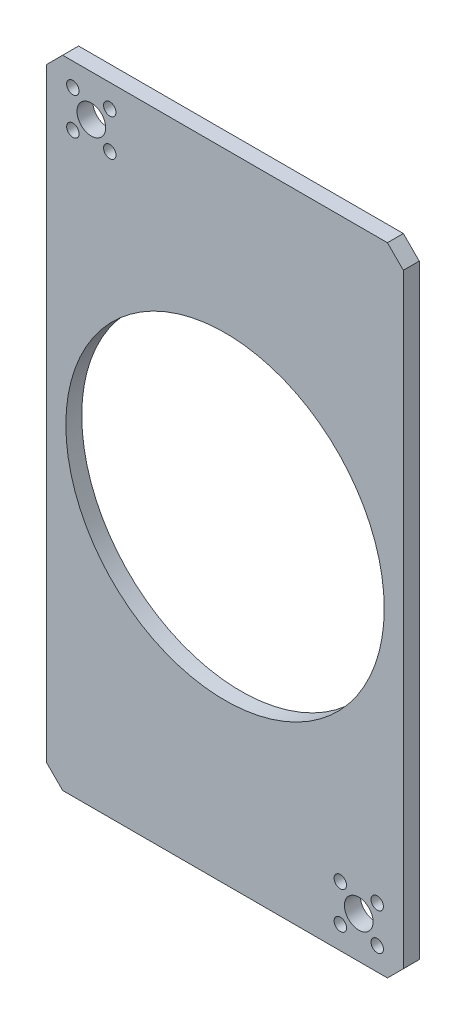
ISO-10303-21;
HEADER;
FILE_DESCRIPTION(('STEP AP214'),'2;1');
FILE_NAME('part.step','',(''),(''),'','','');
FILE_SCHEMA(('AUTOMOTIVE_DESIGN { 1 0 10303 214 1 1 1 1 }'));
ENDSEC;
DATA;
#1=APPLICATION_CONTEXT('core data for automotive mechanical design processes');
#2=APPLICATION_PROTOCOL_DEFINITION('international standard','automotive_design',2000,#1);
#3=PRODUCT_CONTEXT('',#1,'mechanical');
#4=PRODUCT('Part','Part','',(#3));
#5=PRODUCT_RELATED_PRODUCT_CATEGORY('part','',(#4));
#6=PRODUCT_DEFINITION_FORMATION('','',#4);
#7=PRODUCT_DEFINITION_CONTEXT('part definition',#1,'design');
#8=PRODUCT_DEFINITION('design','',#6,#7);
#9=PRODUCT_DEFINITION_SHAPE('','',#8);
#10=(LENGTH_UNIT() NAMED_UNIT(*) SI_UNIT(.MILLI.,.METRE.));
#11=(NAMED_UNIT(*) PLANE_ANGLE_UNIT() SI_UNIT($,.RADIAN.));
#12=(NAMED_UNIT(*) SI_UNIT($,.STERADIAN.) SOLID_ANGLE_UNIT());
#13=UNCERTAINTY_MEASURE_WITH_UNIT(LENGTH_MEASURE(1.E-05),#10,'distance_accuracy_value','');
#14=(GEOMETRIC_REPRESENTATION_CONTEXT(3) GLOBAL_UNCERTAINTY_ASSIGNED_CONTEXT((#13)) GLOBAL_UNIT_ASSIGNED_CONTEXT((#10,
#11,#12)) REPRESENTATION_CONTEXT('',''));
#15=CARTESIAN_POINT('',(0.,0.,0.));
#16=DIRECTION('',(0.,0.,1.));
#17=DIRECTION('',(1.,0.,0.));
#18=AXIS2_PLACEMENT_3D('',#15,#16,#17);
#19=CARTESIAN_POINT('',(56.,-100.,5.));
#20=DIRECTION('',(-1.,0.,0.));
#21=DIRECTION('',(0.,0.,1.));
#22=AXIS2_PLACEMENT_3D('',#19,#20,#21);
#23=PLANE('',#22);
#24=DIRECTION('',(0.,1.,0.));
#25=VECTOR('',#24,1.);
#26=CARTESIAN_POINT('',(56.,-100.,5.));
#27=LINE('',#26,#25);
#28=CARTESIAN_POINT('',(56.,-95.,5.));
#29=VERTEX_POINT('',#28);
#30=CARTESIAN_POINT('',(56.,95.,5.));
#31=VERTEX_POINT('',#30);
#32=EDGE_CURVE('E125',#29,#31,#27,.T.);
#33=ORIENTED_EDGE('',*,*,#32,.F.);
#34=DIRECTION('',(0.,0.,-1.));
#35=VECTOR('',#34,1.);
#36=CARTESIAN_POINT('',(56.,-95.,5.));
#37=LINE('',#36,#35);
#38=CARTESIAN_POINT('',(56.,-95.,0.));
#39=VERTEX_POINT('',#38);
#40=EDGE_CURVE('E151',#29,#39,#37,.T.);
#41=ORIENTED_EDGE('',*,*,#40,.T.);
#42=DIRECTION('',(0.,1.,0.));
#43=VECTOR('',#42,1.);
#44=CARTESIAN_POINT('',(56.,-100.,0.));
#45=LINE('',#44,#43);
#46=CARTESIAN_POINT('',(56.,95.,0.));
#47=VERTEX_POINT('',#46);
#48=EDGE_CURVE('E157',#39,#47,#45,.T.);
#49=ORIENTED_EDGE('',*,*,#48,.T.);
#50=DIRECTION('',(0.,0.,1.));
#51=VECTOR('',#50,1.);
#52=CARTESIAN_POINT('',(56.,95.,5.));
#53=LINE('',#52,#51);
#54=EDGE_CURVE('E149',#47,#31,#53,.T.);
#55=ORIENTED_EDGE('',*,*,#54,.T.);
#56=EDGE_LOOP('',(#33,#41,#49,#55));
#57=FACE_BOUND('',#56,.T.);
#58=ADVANCED_FACE('F33',(#57),#23,.F.);
#59=CARTESIAN_POINT('',(-56.,100.,5.));
#60=DIRECTION('',(0.,-1.,0.));
#61=DIRECTION('',(0.,0.,-1.));
#62=AXIS2_PLACEMENT_3D('',#59,#60,#61);
#63=PLANE('',#62);
#64=DIRECTION('',(-1.,0.,0.));
#65=VECTOR('',#64,1.);
#66=CARTESIAN_POINT('',(-56.,100.,5.));
#67=LINE('',#66,#65);
#68=CARTESIAN_POINT('',(51.,100.,5.));
#69=VERTEX_POINT('',#68);
#70=CARTESIAN_POINT('',(-51.,100.,5.));
#71=VERTEX_POINT('',#70);
#72=EDGE_CURVE('E128',#69,#71,#67,.T.);
#73=ORIENTED_EDGE('',*,*,#72,.F.);
#74=DIRECTION('',(0.,0.,-1.));
#75=VECTOR('',#74,1.);
#76=CARTESIAN_POINT('',(51.,100.,5.));
#77=LINE('',#76,#75);
#78=CARTESIAN_POINT('',(51.,100.,0.));
#79=VERTEX_POINT('',#78);
#80=EDGE_CURVE('E11',#69,#79,#77,.T.);
#81=ORIENTED_EDGE('',*,*,#80,.T.);
#82=DIRECTION('',(-1.,0.,0.));
#83=VECTOR('',#82,1.);
#84=CARTESIAN_POINT('',(-56.,100.,0.));
#85=LINE('',#84,#83);
#86=CARTESIAN_POINT('',(-51.,100.,0.));
#87=VERTEX_POINT('',#86);
#88=EDGE_CURVE('E130',#79,#87,#85,.T.);
#89=ORIENTED_EDGE('',*,*,#88,.T.);
#90=DIRECTION('',(0.,0.,1.));
#91=VECTOR('',#90,1.);
#92=CARTESIAN_POINT('',(-51.,100.,5.));
#93=LINE('',#92,#91);
#94=EDGE_CURVE('E41',#87,#71,#93,.T.);
#95=ORIENTED_EDGE('',*,*,#94,.T.);
#96=EDGE_LOOP('',(#73,#81,#89,#95));
#97=FACE_BOUND('',#96,.T.);
#98=ADVANCED_FACE('F273',(#97),#63,.F.);
#99=CARTESIAN_POINT('',(-56.,-100.,5.));
#100=DIRECTION('',(1.,0.,0.));
#101=DIRECTION('',(0.,0.,-1.));
#102=AXIS2_PLACEMENT_3D('',#99,#100,#101);
#103=PLANE('',#102);
#104=DIRECTION('',(0.,-1.,0.));
#105=VECTOR('',#104,1.);
#106=CARTESIAN_POINT('',(-56.,-100.,0.));
#107=LINE('',#106,#105);
#108=CARTESIAN_POINT('',(-56.,95.,0.));
#109=VERTEX_POINT('',#108);
#110=CARTESIAN_POINT('',(-56.,-95.,0.));
#111=VERTEX_POINT('',#110);
#112=EDGE_CURVE('E126',#109,#111,#107,.T.);
#113=ORIENTED_EDGE('',*,*,#112,.T.);
#114=DIRECTION('',(0.,0.,1.));
#115=VECTOR('',#114,1.);
#116=CARTESIAN_POINT('',(-56.,-95.,5.));
#117=LINE('',#116,#115);
#118=CARTESIAN_POINT('',(-56.,-95.,5.));
#119=VERTEX_POINT('',#118);
#120=EDGE_CURVE('E104',#111,#119,#117,.T.);
#121=ORIENTED_EDGE('',*,*,#120,.T.);
#122=DIRECTION('',(0.,-1.,0.));
#123=VECTOR('',#122,1.);
#124=CARTESIAN_POINT('',(-56.,-100.,5.));
#125=LINE('',#124,#123);
#126=CARTESIAN_POINT('',(-56.,95.,5.));
#127=VERTEX_POINT('',#126);
#128=EDGE_CURVE('E169',#127,#119,#125,.T.);
#129=ORIENTED_EDGE('',*,*,#128,.F.);
#130=DIRECTION('',(0.,0.,-1.));
#131=VECTOR('',#130,1.);
#132=CARTESIAN_POINT('',(-56.,95.,5.));
#133=LINE('',#132,#131);
#134=EDGE_CURVE('E109',#127,#109,#133,.T.);
#135=ORIENTED_EDGE('',*,*,#134,.T.);
#136=EDGE_LOOP('',(#113,#121,#129,#135));
#137=FACE_BOUND('',#136,.T.);
#138=ADVANCED_FACE('F271',(#137),#103,.F.);
#139=CARTESIAN_POINT('',(-56.,-100.,5.));
#140=DIRECTION('',(0.,1.,0.));
#141=DIRECTION('',(0.,0.,1.));
#142=AXIS2_PLACEMENT_3D('',#139,#140,#141);
#143=PLANE('',#142);
#144=DIRECTION('',(1.,0.,0.));
#145=VECTOR('',#144,1.);
#146=CARTESIAN_POINT('',(-56.,-100.,5.));
#147=LINE('',#146,#145);
#148=CARTESIAN_POINT('',(-51.,-100.,5.));
#149=VERTEX_POINT('',#148);
#150=CARTESIAN_POINT('',(51.,-100.,5.));
#151=VERTEX_POINT('',#150);
#152=EDGE_CURVE('E119',#149,#151,#147,.T.);
#153=ORIENTED_EDGE('',*,*,#152,.F.);
#154=DIRECTION('',(0.,0.,-1.));
#155=VECTOR('',#154,1.);
#156=CARTESIAN_POINT('',(-51.,-100.,5.));
#157=LINE('',#156,#155);
#158=CARTESIAN_POINT('',(-51.,-100.,0.));
#159=VERTEX_POINT('',#158);
#160=EDGE_CURVE('E103',#149,#159,#157,.T.);
#161=ORIENTED_EDGE('',*,*,#160,.T.);
#162=DIRECTION('',(1.,0.,0.));
#163=VECTOR('',#162,1.);
#164=CARTESIAN_POINT('',(-56.,-100.,0.));
#165=LINE('',#164,#163);
#166=CARTESIAN_POINT('',(51.,-100.,0.));
#167=VERTEX_POINT('',#166);
#168=EDGE_CURVE('E116',#159,#167,#165,.T.);
#169=ORIENTED_EDGE('',*,*,#168,.T.);
#170=DIRECTION('',(0.,0.,1.));
#171=VECTOR('',#170,1.);
#172=CARTESIAN_POINT('',(51.,-100.,5.));
#173=LINE('',#172,#171);
#174=EDGE_CURVE('E121',#167,#151,#173,.T.);
#175=ORIENTED_EDGE('',*,*,#174,.T.);
#176=EDGE_LOOP('',(#153,#161,#169,#175));
#177=FACE_BOUND('',#176,.T.);
#178=ADVANCED_FACE('F115',(#177),#143,.F.);
#179=CARTESIAN_POINT('',(0.,0.,5.));
#180=DIRECTION('',(0.,0.,-1.));
#181=DIRECTION('',(-1.,0.,0.));
#182=AXIS2_PLACEMENT_3D('',#179,#180,#181);
#183=PLANE('',#182);
#184=CARTESIAN_POINT('',(0.,0.,5.));
#185=DIRECTION('',(0.,0.,1.));
#186=DIRECTION('',(1.,0.,0.));
#187=AXIS2_PLACEMENT_3D('',#184,#185,#186);
#188=CIRCLE('',#187,50.);
#189=CARTESIAN_POINT('',(50.,0.,5.));
#190=VERTEX_POINT('',#189);
#191=EDGE_CURVE('E230',#190,#190,#188,.T.);
#192=ORIENTED_EDGE('',*,*,#191,.F.);
#193=EDGE_LOOP('',(#192));
#194=FACE_BOUND('',#193,.T.);
#195=CARTESIAN_POINT('',(47.8000000000095,-81.2,5.));
#196=DIRECTION('',(0.,0.,1.));
#197=DIRECTION('',(-1.,0.,0.));
#198=AXIS2_PLACEMENT_3D('',#195,#196,#197);
#199=CIRCLE('',#198,1.94999999999284);
#200=CARTESIAN_POINT('',(45.8500000000166,-81.2,5.));
#201=VERTEX_POINT('',#200);
#202=EDGE_CURVE('E206',#201,#201,#199,.T.);
#203=ORIENTED_EDGE('',*,*,#202,.F.);
#204=EDGE_LOOP('',(#203));
#205=FACE_BOUND('',#204,.T.);
#206=CARTESIAN_POINT('',(47.8000000000095,-92.8,5.));
#207=DIRECTION('',(0.,0.,1.));
#208=DIRECTION('',(1.,0.,0.));
#209=AXIS2_PLACEMENT_3D('',#206,#207,#208);
#210=CIRCLE('',#209,1.94999999999284);
#211=CARTESIAN_POINT('',(49.7500000000023,-92.8,5.));
#212=VERTEX_POINT('',#211);
#213=EDGE_CURVE('E213',#212,#212,#210,.T.);
#214=ORIENTED_EDGE('',*,*,#213,.F.);
#215=EDGE_LOOP('',(#214));
#216=FACE_BOUND('',#215,.T.);
#217=CARTESIAN_POINT('',(42.0000000000095,-87.,5.));
#218=DIRECTION('',(0.,0.,1.));
#219=DIRECTION('',(1.,0.,0.));
#220=AXIS2_PLACEMENT_3D('',#217,#218,#219);
#221=CIRCLE('',#220,4.49999999999287);
#222=CARTESIAN_POINT('',(46.5000000000024,-87.,5.));
#223=VERTEX_POINT('',#222);
#224=EDGE_CURVE('E200',#223,#223,#221,.T.);
#225=ORIENTED_EDGE('',*,*,#224,.F.);
#226=EDGE_LOOP('',(#225));
#227=FACE_BOUND('',#226,.T.);
#228=CARTESIAN_POINT('',(36.2000000000095,-81.2,5.));
#229=DIRECTION('',(0.,0.,1.));
#230=DIRECTION('',(1.,0.,0.));
#231=AXIS2_PLACEMENT_3D('',#228,#229,#230);
#232=CIRCLE('',#231,1.94999999999285);
#233=CARTESIAN_POINT('',(38.1500000000023,-81.2,5.));
#234=VERTEX_POINT('',#233);
#235=EDGE_CURVE('E225',#234,#234,#232,.T.);
#236=ORIENTED_EDGE('',*,*,#235,.F.);
#237=EDGE_LOOP('',(#236));
#238=FACE_BOUND('',#237,.T.);
#239=CARTESIAN_POINT('',(36.2000000000095,-92.8,5.));
#240=DIRECTION('',(0.,0.,1.));
#241=DIRECTION('',(-1.,0.,0.));
#242=AXIS2_PLACEMENT_3D('',#239,#240,#241);
#243=CIRCLE('',#242,1.94999999999285);
#244=CARTESIAN_POINT('',(34.2500000000166,-92.8,5.));
#245=VERTEX_POINT('',#244);
#246=EDGE_CURVE('E218',#245,#245,#243,.T.);
#247=ORIENTED_EDGE('',*,*,#246,.F.);
#248=EDGE_LOOP('',(#247));
#249=FACE_BOUND('',#248,.T.);
#250=CARTESIAN_POINT('',(-36.2000000000095,92.8,5.));
#251=DIRECTION('',(0.,0.,1.));
#252=DIRECTION('',(-1.,0.,0.));
#253=AXIS2_PLACEMENT_3D('',#250,#251,#252);
#254=CIRCLE('',#253,1.95000000000713);
#255=CARTESIAN_POINT('',(-38.1500000000166,92.8,5.));
#256=VERTEX_POINT('',#255);
#257=EDGE_CURVE('E176',#256,#256,#254,.T.);
#258=ORIENTED_EDGE('',*,*,#257,.F.);
#259=EDGE_LOOP('',(#258));
#260=FACE_BOUND('',#259,.T.);
#261=CARTESIAN_POINT('',(-36.2000000000095,81.2,5.));
#262=DIRECTION('',(0.,0.,1.));
#263=DIRECTION('',(1.,0.,0.));
#264=AXIS2_PLACEMENT_3D('',#261,#262,#263);
#265=CIRCLE('',#264,1.95000000000713);
#266=CARTESIAN_POINT('',(-34.2500000000023,81.2,5.));
#267=VERTEX_POINT('',#266);
#268=EDGE_CURVE('E183',#267,#267,#265,.T.);
#269=ORIENTED_EDGE('',*,*,#268,.F.);
#270=EDGE_LOOP('',(#269));
#271=FACE_BOUND('',#270,.T.);
#272=CARTESIAN_POINT('',(-47.8000000000095,81.2,5.));
#273=DIRECTION('',(0.,0.,1.));
#274=DIRECTION('',(-1.,0.,0.));
#275=AXIS2_PLACEMENT_3D('',#272,#273,#274);
#276=CIRCLE('',#275,1.95000000000712);
#277=CARTESIAN_POINT('',(-49.7500000000166,81.2,5.));
#278=VERTEX_POINT('',#277);
#279=EDGE_CURVE('E189',#278,#278,#276,.T.);
#280=ORIENTED_EDGE('',*,*,#279,.F.);
#281=EDGE_LOOP('',(#280));
#282=FACE_BOUND('',#281,.T.);
#283=CARTESIAN_POINT('',(-47.8000000000095,92.8,5.));
#284=DIRECTION('',(0.,0.,1.));
#285=DIRECTION('',(1.,0.,0.));
#286=AXIS2_PLACEMENT_3D('',#283,#284,#285);
#287=CIRCLE('',#286,1.95000000000713);
#288=CARTESIAN_POINT('',(-45.8500000000023,92.8,5.));
#289=VERTEX_POINT('',#288);
#290=EDGE_CURVE('E195',#289,#289,#287,.T.);
#291=ORIENTED_EDGE('',*,*,#290,.F.);
#292=EDGE_LOOP('',(#291));
#293=FACE_BOUND('',#292,.T.);
#294=CARTESIAN_POINT('',(-42.0000000000095,87.,5.));
#295=DIRECTION('',(0.,0.,1.));
#296=DIRECTION('',(1.,0.,0.));
#297=AXIS2_PLACEMENT_3D('',#294,#295,#296);
#298=CIRCLE('',#297,4.50000000000714);
#299=CARTESIAN_POINT('',(-37.5000000000024,87.,5.));
#300=VERTEX_POINT('',#299);
#301=EDGE_CURVE('E165',#300,#300,#298,.T.);
#302=ORIENTED_EDGE('',*,*,#301,.F.);
#303=EDGE_LOOP('',(#302));
#304=FACE_BOUND('',#303,.T.);
#305=ORIENTED_EDGE('',*,*,#128,.T.);
#306=DIRECTION('',(-0.707106781186548,0.707106781186548,0.));
#307=VECTOR('',#306,1.);
#308=CARTESIAN_POINT('',(-51.,-100.,5.));
#309=LINE('',#308,#307);
#310=EDGE_CURVE('E147',#119,#149,#309,.F.);
#311=ORIENTED_EDGE('',*,*,#310,.T.);
#312=ORIENTED_EDGE('',*,*,#152,.T.);
#313=DIRECTION('',(-0.707106781186548,-0.707106781186548,0.));
#314=VECTOR('',#313,1.);
#315=CARTESIAN_POINT('',(56.,-95.,5.));
#316=LINE('',#315,#314);
#317=EDGE_CURVE('E145',#151,#29,#316,.F.);
#318=ORIENTED_EDGE('',*,*,#317,.T.);
#319=ORIENTED_EDGE('',*,*,#32,.T.);
#320=DIRECTION('',(0.707106781186548,-0.707106781186548,0.));
#321=VECTOR('',#320,1.);
#322=CARTESIAN_POINT('',(51.,100.,5.));
#323=LINE('',#322,#321);
#324=EDGE_CURVE('E54',#31,#69,#323,.F.);
#325=ORIENTED_EDGE('',*,*,#324,.T.);
#326=ORIENTED_EDGE('',*,*,#72,.T.);
#327=DIRECTION('',(0.707106781186548,0.707106781186548,0.));
#328=VECTOR('',#327,1.);
#329=CARTESIAN_POINT('',(-56.,95.,5.));
#330=LINE('',#329,#328);
#331=EDGE_CURVE('E142',#71,#127,#330,.F.);
#332=ORIENTED_EDGE('',*,*,#331,.T.);
#333=EDGE_LOOP('',(#305,#311,#312,#318,#319,#325,#326,#332));
#334=FACE_BOUND('',#333,.T.);
#335=ADVANCED_FACE('F244',(#194,#205,#216,#227,#238,#249,#260,#271,#282,#293,#304,#334),#183,.F.);
#336=CARTESIAN_POINT('',(0.,0.,0.));
#337=DIRECTION('',(0.,0.,-1.));
#338=DIRECTION('',(-1.,0.,0.));
#339=AXIS2_PLACEMENT_3D('',#336,#337,#338);
#340=PLANE('',#339);
#341=CARTESIAN_POINT('',(0.,0.,0.));
#342=DIRECTION('',(0.,0.,1.));
#343=DIRECTION('',(1.,0.,0.));
#344=AXIS2_PLACEMENT_3D('',#341,#342,#343);
#345=CIRCLE('',#344,50.);
#346=CARTESIAN_POINT('',(50.,0.,0.));
#347=VERTEX_POINT('',#346);
#348=EDGE_CURVE('E222',#347,#347,#345,.T.);
#349=ORIENTED_EDGE('',*,*,#348,.T.);
#350=EDGE_LOOP('',(#349));
#351=FACE_BOUND('',#350,.T.);
#352=CARTESIAN_POINT('',(47.8000000000095,-81.2,0.));
#353=DIRECTION('',(0.,0.,1.));
#354=DIRECTION('',(-1.,0.,0.));
#355=AXIS2_PLACEMENT_3D('',#352,#353,#354);
#356=CIRCLE('',#355,1.94999999999284);
#357=CARTESIAN_POINT('',(45.8500000000166,-81.2,0.));
#358=VERTEX_POINT('',#357);
#359=EDGE_CURVE('E209',#358,#358,#356,.T.);
#360=ORIENTED_EDGE('',*,*,#359,.T.);
#361=EDGE_LOOP('',(#360));
#362=FACE_BOUND('',#361,.T.);
#363=CARTESIAN_POINT('',(47.8000000000095,-92.8,0.));
#364=DIRECTION('',(0.,0.,1.));
#365=DIRECTION('',(1.,0.,0.));
#366=AXIS2_PLACEMENT_3D('',#363,#364,#365);
#367=CIRCLE('',#366,1.94999999999284);
#368=CARTESIAN_POINT('',(49.7500000000023,-92.8,0.));
#369=VERTEX_POINT('',#368);
#370=EDGE_CURVE('E203',#369,#369,#367,.T.);
#371=ORIENTED_EDGE('',*,*,#370,.T.);
#372=EDGE_LOOP('',(#371));
#373=FACE_BOUND('',#372,.T.);
#374=CARTESIAN_POINT('',(42.0000000000095,-87.,0.));
#375=DIRECTION('',(0.,0.,1.));
#376=DIRECTION('',(1.,0.,0.));
#377=AXIS2_PLACEMENT_3D('',#374,#375,#376);
#378=CIRCLE('',#377,4.49999999999287);
#379=CARTESIAN_POINT('',(46.5000000000024,-87.,0.));
#380=VERTEX_POINT('',#379);
#381=EDGE_CURVE('E180',#380,#380,#378,.T.);
#382=ORIENTED_EDGE('',*,*,#381,.T.);
#383=EDGE_LOOP('',(#382));
#384=FACE_BOUND('',#383,.T.);
#385=CARTESIAN_POINT('',(36.2000000000095,-81.2,0.));
#386=DIRECTION('',(0.,0.,1.));
#387=DIRECTION('',(1.,0.,0.));
#388=AXIS2_PLACEMENT_3D('',#385,#386,#387);
#389=CIRCLE('',#388,1.94999999999285);
#390=CARTESIAN_POINT('',(38.1500000000023,-81.2,0.));
#391=VERTEX_POINT('',#390);
#392=EDGE_CURVE('E210',#391,#391,#389,.T.);
#393=ORIENTED_EDGE('',*,*,#392,.T.);
#394=EDGE_LOOP('',(#393));
#395=FACE_BOUND('',#394,.T.);
#396=CARTESIAN_POINT('',(36.2000000000095,-92.8,0.));
#397=DIRECTION('',(0.,0.,1.));
#398=DIRECTION('',(-1.,0.,0.));
#399=AXIS2_PLACEMENT_3D('',#396,#397,#398);
#400=CIRCLE('',#399,1.94999999999285);
#401=CARTESIAN_POINT('',(34.2500000000166,-92.8,0.));
#402=VERTEX_POINT('',#401);
#403=EDGE_CURVE('E221',#402,#402,#400,.T.);
#404=ORIENTED_EDGE('',*,*,#403,.T.);
#405=EDGE_LOOP('',(#404));
#406=FACE_BOUND('',#405,.T.);
#407=CARTESIAN_POINT('',(-36.2000000000095,92.8,0.));
#408=DIRECTION('',(0.,0.,1.));
#409=DIRECTION('',(-1.,0.,0.));
#410=AXIS2_PLACEMENT_3D('',#407,#408,#409);
#411=CIRCLE('',#410,1.95000000000713);
#412=CARTESIAN_POINT('',(-38.1500000000166,92.8,0.));
#413=VERTEX_POINT('',#412);
#414=EDGE_CURVE('E179',#413,#413,#411,.T.);
#415=ORIENTED_EDGE('',*,*,#414,.T.);
#416=EDGE_LOOP('',(#415));
#417=FACE_BOUND('',#416,.T.);
#418=CARTESIAN_POINT('',(-36.2000000000095,81.2,0.));
#419=DIRECTION('',(0.,0.,1.));
#420=DIRECTION('',(1.,0.,0.));
#421=AXIS2_PLACEMENT_3D('',#418,#419,#420);
#422=CIRCLE('',#421,1.95000000000713);
#423=CARTESIAN_POINT('',(-34.2500000000023,81.2,0.));
#424=VERTEX_POINT('',#423);
#425=EDGE_CURVE('E186',#424,#424,#422,.T.);
#426=ORIENTED_EDGE('',*,*,#425,.T.);
#427=EDGE_LOOP('',(#426));
#428=FACE_BOUND('',#427,.T.);
#429=CARTESIAN_POINT('',(-47.8000000000095,81.2,0.));
#430=DIRECTION('',(0.,0.,1.));
#431=DIRECTION('',(-1.,0.,0.));
#432=AXIS2_PLACEMENT_3D('',#429,#430,#431);
#433=CIRCLE('',#432,1.95000000000712);
#434=CARTESIAN_POINT('',(-49.7500000000166,81.2,0.));
#435=VERTEX_POINT('',#434);
#436=EDGE_CURVE('E192',#435,#435,#433,.T.);
#437=ORIENTED_EDGE('',*,*,#436,.T.);
#438=EDGE_LOOP('',(#437));
#439=FACE_BOUND('',#438,.T.);
#440=CARTESIAN_POINT('',(-47.8000000000095,92.8,0.));
#441=DIRECTION('',(0.,0.,1.));
#442=DIRECTION('',(1.,0.,0.));
#443=AXIS2_PLACEMENT_3D('',#440,#441,#442);
#444=CIRCLE('',#443,1.95000000000713);
#445=CARTESIAN_POINT('',(-45.8500000000023,92.8,0.));
#446=VERTEX_POINT('',#445);
#447=EDGE_CURVE('E174',#446,#446,#444,.T.);
#448=ORIENTED_EDGE('',*,*,#447,.T.);
#449=EDGE_LOOP('',(#448));
#450=FACE_BOUND('',#449,.T.);
#451=CARTESIAN_POINT('',(-42.0000000000095,87.,0.));
#452=DIRECTION('',(0.,0.,1.));
#453=DIRECTION('',(1.,0.,0.));
#454=AXIS2_PLACEMENT_3D('',#451,#452,#453);
#455=CIRCLE('',#454,4.50000000000714);
#456=CARTESIAN_POINT('',(-37.5000000000024,87.,0.));
#457=VERTEX_POINT('',#456);
#458=EDGE_CURVE('E162',#457,#457,#455,.T.);
#459=ORIENTED_EDGE('',*,*,#458,.T.);
#460=EDGE_LOOP('',(#459));
#461=FACE_BOUND('',#460,.T.);
#462=ORIENTED_EDGE('',*,*,#168,.F.);
#463=DIRECTION('',(0.707106781186548,-0.707106781186548,0.));
#464=VECTOR('',#463,1.);
#465=CARTESIAN_POINT('',(-75.5,-75.5,0.));
#466=LINE('',#465,#464);
#467=EDGE_CURVE('E99',#159,#111,#466,.F.);
#468=ORIENTED_EDGE('',*,*,#467,.T.);
#469=ORIENTED_EDGE('',*,*,#112,.F.);
#470=DIRECTION('',(-0.707106781186548,-0.707106781186548,0.));
#471=VECTOR('',#470,1.);
#472=CARTESIAN_POINT('',(-75.5,75.5,0.));
#473=LINE('',#472,#471);
#474=EDGE_CURVE('E120',#109,#87,#473,.F.);
#475=ORIENTED_EDGE('',*,*,#474,.T.);
#476=ORIENTED_EDGE('',*,*,#88,.F.);
#477=DIRECTION('',(-0.707106781186548,0.707106781186548,0.));
#478=VECTOR('',#477,1.);
#479=CARTESIAN_POINT('',(75.5,75.5,0.));
#480=LINE('',#479,#478);
#481=EDGE_CURVE('E136',#79,#47,#480,.F.);
#482=ORIENTED_EDGE('',*,*,#481,.T.);
#483=ORIENTED_EDGE('',*,*,#48,.F.);
#484=DIRECTION('',(0.707106781186548,0.707106781186548,0.));
#485=VECTOR('',#484,1.);
#486=CARTESIAN_POINT('',(75.5,-75.5,0.));
#487=LINE('',#486,#485);
#488=EDGE_CURVE('E110',#39,#167,#487,.F.);
#489=ORIENTED_EDGE('',*,*,#488,.T.);
#490=EDGE_LOOP('',(#462,#468,#469,#475,#476,#482,#483,#489));
#491=FACE_BOUND('',#490,.T.);
#492=ADVANCED_FACE('F123',(#351,#362,#373,#384,#395,#406,#417,#428,#439,#450,#461,#491),#340,.T.);
#493=CARTESIAN_POINT('',(-42.0000000000095,87.,0.));
#494=DIRECTION('',(0.,0.,1.));
#495=DIRECTION('',(1.,0.,0.));
#496=AXIS2_PLACEMENT_3D('',#493,#494,#495);
#497=CYLINDRICAL_SURFACE('',#496,4.50000000000714);
#498=ORIENTED_EDGE('',*,*,#458,.F.);
#499=EDGE_LOOP('',(#498));
#500=FACE_BOUND('',#499,.T.);
#501=ORIENTED_EDGE('',*,*,#301,.T.);
#502=EDGE_LOOP('',(#501));
#503=FACE_BOUND('',#502,.T.);
#504=ADVANCED_FACE('F298',(#500,#503),#497,.F.);
#505=CARTESIAN_POINT('',(-47.8000000000095,92.8,0.));
#506=DIRECTION('',(0.,0.,1.));
#507=DIRECTION('',(1.,0.,0.));
#508=AXIS2_PLACEMENT_3D('',#505,#506,#507);
#509=CYLINDRICAL_SURFACE('',#508,1.95000000000713);
#510=ORIENTED_EDGE('',*,*,#447,.F.);
#511=EDGE_LOOP('',(#510));
#512=FACE_BOUND('',#511,.T.);
#513=ORIENTED_EDGE('',*,*,#290,.T.);
#514=EDGE_LOOP('',(#513));
#515=FACE_BOUND('',#514,.T.);
#516=ADVANCED_FACE('F302',(#512,#515),#509,.F.);
#517=CARTESIAN_POINT('',(-47.8000000000095,81.2,0.));
#518=DIRECTION('',(0.,0.,1.));
#519=DIRECTION('',(1.,0.,0.));
#520=AXIS2_PLACEMENT_3D('',#517,#518,#519);
#521=CYLINDRICAL_SURFACE('',#520,1.95000000000712);
#522=ORIENTED_EDGE('',*,*,#436,.F.);
#523=EDGE_LOOP('',(#522));
#524=FACE_BOUND('',#523,.T.);
#525=ORIENTED_EDGE('',*,*,#279,.T.);
#526=EDGE_LOOP('',(#525));
#527=FACE_BOUND('',#526,.T.);
#528=ADVANCED_FACE('F312',(#524,#527),#521,.F.);
#529=CARTESIAN_POINT('',(-36.2000000000095,81.2,0.));
#530=DIRECTION('',(0.,0.,1.));
#531=DIRECTION('',(1.,0.,0.));
#532=AXIS2_PLACEMENT_3D('',#529,#530,#531);
#533=CYLINDRICAL_SURFACE('',#532,1.95000000000713);
#534=ORIENTED_EDGE('',*,*,#425,.F.);
#535=EDGE_LOOP('',(#534));
#536=FACE_BOUND('',#535,.T.);
#537=ORIENTED_EDGE('',*,*,#268,.T.);
#538=EDGE_LOOP('',(#537));
#539=FACE_BOUND('',#538,.T.);
#540=ADVANCED_FACE('F308',(#536,#539),#533,.F.);
#541=CARTESIAN_POINT('',(-36.2000000000095,92.8,0.));
#542=DIRECTION('',(0.,0.,1.));
#543=DIRECTION('',(1.,0.,0.));
#544=AXIS2_PLACEMENT_3D('',#541,#542,#543);
#545=CYLINDRICAL_SURFACE('',#544,1.95000000000713);
#546=ORIENTED_EDGE('',*,*,#414,.F.);
#547=EDGE_LOOP('',(#546));
#548=FACE_BOUND('',#547,.T.);
#549=ORIENTED_EDGE('',*,*,#257,.T.);
#550=EDGE_LOOP('',(#549));
#551=FACE_BOUND('',#550,.T.);
#552=ADVANCED_FACE('F304',(#548,#551),#545,.F.);
#553=CARTESIAN_POINT('',(36.2000000000095,-92.8,0.));
#554=DIRECTION('',(0.,0.,1.));
#555=DIRECTION('',(1.,0.,0.));
#556=AXIS2_PLACEMENT_3D('',#553,#554,#555);
#557=CYLINDRICAL_SURFACE('',#556,1.94999999999285);
#558=ORIENTED_EDGE('',*,*,#403,.F.);
#559=EDGE_LOOP('',(#558));
#560=FACE_BOUND('',#559,.T.);
#561=ORIENTED_EDGE('',*,*,#246,.T.);
#562=EDGE_LOOP('',(#561));
#563=FACE_BOUND('',#562,.T.);
#564=ADVANCED_FACE('F307',(#560,#563),#557,.F.);
#565=CARTESIAN_POINT('',(36.2000000000095,-81.2,0.));
#566=DIRECTION('',(0.,0.,1.));
#567=DIRECTION('',(1.,0.,0.));
#568=AXIS2_PLACEMENT_3D('',#565,#566,#567);
#569=CYLINDRICAL_SURFACE('',#568,1.94999999999285);
#570=ORIENTED_EDGE('',*,*,#392,.F.);
#571=EDGE_LOOP('',(#570));
#572=FACE_BOUND('',#571,.T.);
#573=ORIENTED_EDGE('',*,*,#235,.T.);
#574=EDGE_LOOP('',(#573));
#575=FACE_BOUND('',#574,.T.);
#576=ADVANCED_FACE('F324',(#572,#575),#569,.F.);
#577=CARTESIAN_POINT('',(42.0000000000095,-87.,0.));
#578=DIRECTION('',(0.,0.,1.));
#579=DIRECTION('',(1.,0.,0.));
#580=AXIS2_PLACEMENT_3D('',#577,#578,#579);
#581=CYLINDRICAL_SURFACE('',#580,4.49999999999287);
#582=ORIENTED_EDGE('',*,*,#381,.F.);
#583=EDGE_LOOP('',(#582));
#584=FACE_BOUND('',#583,.T.);
#585=ORIENTED_EDGE('',*,*,#224,.T.);
#586=EDGE_LOOP('',(#585));
#587=FACE_BOUND('',#586,.T.);
#588=ADVANCED_FACE('F320',(#584,#587),#581,.F.);
#589=CARTESIAN_POINT('',(47.8000000000095,-92.8,0.));
#590=DIRECTION('',(0.,0.,1.));
#591=DIRECTION('',(1.,0.,0.));
#592=AXIS2_PLACEMENT_3D('',#589,#590,#591);
#593=CYLINDRICAL_SURFACE('',#592,1.94999999999284);
#594=ORIENTED_EDGE('',*,*,#370,.F.);
#595=EDGE_LOOP('',(#594));
#596=FACE_BOUND('',#595,.T.);
#597=ORIENTED_EDGE('',*,*,#213,.T.);
#598=EDGE_LOOP('',(#597));
#599=FACE_BOUND('',#598,.T.);
#600=ADVANCED_FACE('F323',(#596,#599),#593,.F.);
#601=CARTESIAN_POINT('',(47.8000000000095,-81.2,0.));
#602=DIRECTION('',(0.,0.,1.));
#603=DIRECTION('',(1.,0.,0.));
#604=AXIS2_PLACEMENT_3D('',#601,#602,#603);
#605=CYLINDRICAL_SURFACE('',#604,1.94999999999284);
#606=ORIENTED_EDGE('',*,*,#359,.F.);
#607=EDGE_LOOP('',(#606));
#608=FACE_BOUND('',#607,.T.);
#609=ORIENTED_EDGE('',*,*,#202,.T.);
#610=EDGE_LOOP('',(#609));
#611=FACE_BOUND('',#610,.T.);
#612=ADVANCED_FACE('F284',(#608,#611),#605,.F.);
#613=CARTESIAN_POINT('',(-51.,-100.,5.));
#614=DIRECTION('',(0.707106781186547,0.707106781186547,0.));
#615=DIRECTION('',(0.,0.,-1.));
#616=AXIS2_PLACEMENT_3D('',#613,#614,#615);
#617=PLANE('',#616);
#618=ORIENTED_EDGE('',*,*,#310,.F.);
#619=ORIENTED_EDGE('',*,*,#120,.F.);
#620=ORIENTED_EDGE('',*,*,#467,.F.);
#621=ORIENTED_EDGE('',*,*,#160,.F.);
#622=EDGE_LOOP('',(#618,#619,#620,#621));
#623=FACE_BOUND('',#622,.T.);
#624=ADVANCED_FACE('F102',(#623),#617,.F.);
#625=CARTESIAN_POINT('',(56.,-95.,5.));
#626=DIRECTION('',(-0.707106781186547,0.707106781186547,0.));
#627=DIRECTION('',(0.,0.,-1.));
#628=AXIS2_PLACEMENT_3D('',#625,#626,#627);
#629=PLANE('',#628);
#630=ORIENTED_EDGE('',*,*,#317,.F.);
#631=ORIENTED_EDGE('',*,*,#174,.F.);
#632=ORIENTED_EDGE('',*,*,#488,.F.);
#633=ORIENTED_EDGE('',*,*,#40,.F.);
#634=EDGE_LOOP('',(#630,#631,#632,#633));
#635=FACE_BOUND('',#634,.T.);
#636=ADVANCED_FACE('F277',(#635),#629,.F.);
#637=CARTESIAN_POINT('',(51.,100.,5.));
#638=DIRECTION('',(-0.707106781186547,-0.707106781186547,0.));
#639=DIRECTION('',(0.,0.,-1.));
#640=AXIS2_PLACEMENT_3D('',#637,#638,#639);
#641=PLANE('',#640);
#642=ORIENTED_EDGE('',*,*,#324,.F.);
#643=ORIENTED_EDGE('',*,*,#54,.F.);
#644=ORIENTED_EDGE('',*,*,#481,.F.);
#645=ORIENTED_EDGE('',*,*,#80,.F.);
#646=EDGE_LOOP('',(#642,#643,#644,#645));
#647=FACE_BOUND('',#646,.T.);
#648=ADVANCED_FACE('F276',(#647),#641,.F.);
#649=CARTESIAN_POINT('',(-56.,95.,5.));
#650=DIRECTION('',(0.707106781186547,-0.707106781186547,0.));
#651=DIRECTION('',(0.,0.,-1.));
#652=AXIS2_PLACEMENT_3D('',#649,#650,#651);
#653=PLANE('',#652);
#654=ORIENTED_EDGE('',*,*,#331,.F.);
#655=ORIENTED_EDGE('',*,*,#94,.F.);
#656=ORIENTED_EDGE('',*,*,#474,.F.);
#657=ORIENTED_EDGE('',*,*,#134,.F.);
#658=EDGE_LOOP('',(#654,#655,#656,#657));
#659=FACE_BOUND('',#658,.T.);
#660=ADVANCED_FACE('F35',(#659),#653,.F.);
#661=CARTESIAN_POINT('',(0.,0.,0.));
#662=DIRECTION('',(0.,0.,1.));
#663=DIRECTION('',(1.,0.,0.));
#664=AXIS2_PLACEMENT_3D('',#661,#662,#663);
#665=CYLINDRICAL_SURFACE('',#664,50.);
#666=ORIENTED_EDGE('',*,*,#348,.F.);
#667=EDGE_LOOP('',(#666));
#668=FACE_BOUND('',#667,.T.);
#669=ORIENTED_EDGE('',*,*,#191,.T.);
#670=EDGE_LOOP('',(#669));
#671=FACE_BOUND('',#670,.T.);
#672=ADVANCED_FACE('F238',(#668,#671),#665,.F.);
#673=CLOSED_SHELL('',(#58,#98,#138,#178,#335,#492,#504,#516,#528,#540,#552,#564,#576,#588,#600,
#612,#624,#636,#648,#660,#672));
#674=MANIFOLD_SOLID_BREP('B2',#673);
#675=ADVANCED_BREP_SHAPE_REPRESENTATION('',(#18,#674),#14);
#676=SHAPE_DEFINITION_REPRESENTATION(#9,#675);
ENDSEC;
END-ISO-10303-21;
